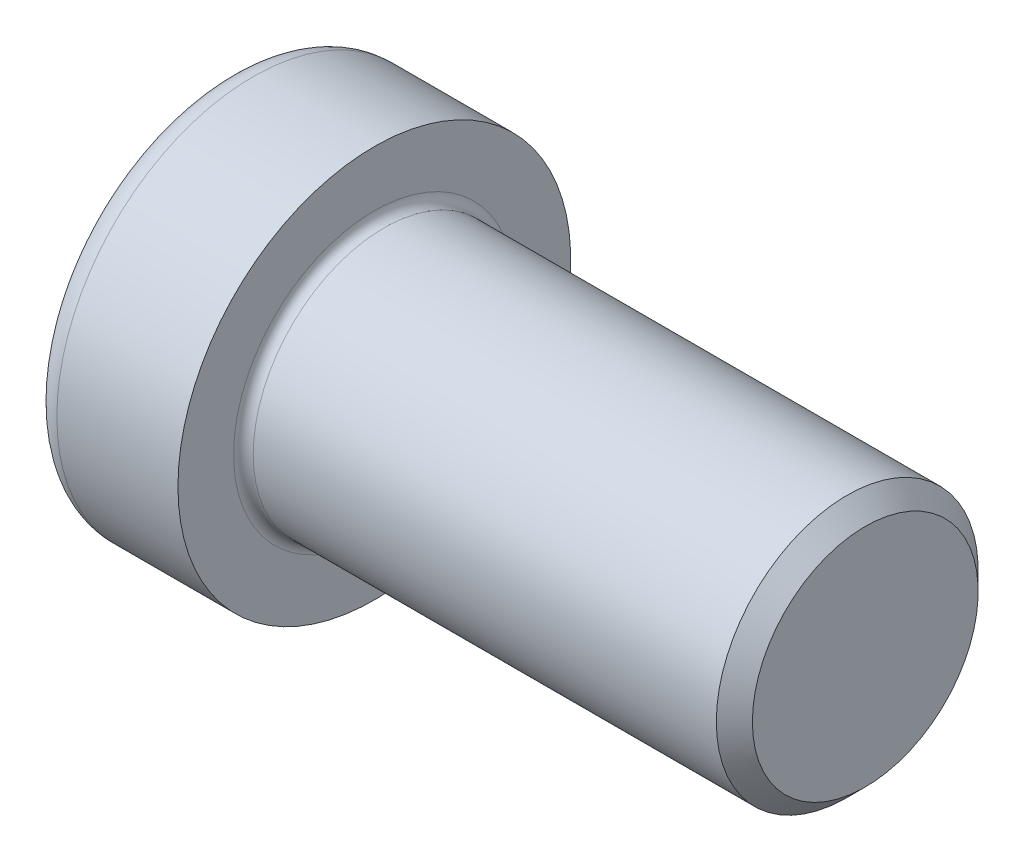
ISO-10303-21;
HEADER;
FILE_DESCRIPTION(('STEP AP214'),'2;1');
FILE_NAME('part.step','',(''),(''),'','','');
FILE_SCHEMA(('AUTOMOTIVE_DESIGN { 1 0 10303 214 1 1 1 1 }'));
ENDSEC;
DATA;
#1=APPLICATION_CONTEXT('core data for automotive mechanical design processes');
#2=APPLICATION_PROTOCOL_DEFINITION('international standard','automotive_design',2000,#1);
#3=PRODUCT_CONTEXT('',#1,'mechanical');
#4=PRODUCT('Part','Part','',(#3));
#5=PRODUCT_RELATED_PRODUCT_CATEGORY('part','',(#4));
#6=PRODUCT_DEFINITION_FORMATION('','',#4);
#7=PRODUCT_DEFINITION_CONTEXT('part definition',#1,'design');
#8=PRODUCT_DEFINITION('design','',#6,#7);
#9=PRODUCT_DEFINITION_SHAPE('','',#8);
#10=(LENGTH_UNIT() NAMED_UNIT(*) SI_UNIT(.MILLI.,.METRE.));
#11=(NAMED_UNIT(*) PLANE_ANGLE_UNIT() SI_UNIT($,.RADIAN.));
#12=(NAMED_UNIT(*) SI_UNIT($,.STERADIAN.) SOLID_ANGLE_UNIT());
#13=UNCERTAINTY_MEASURE_WITH_UNIT(LENGTH_MEASURE(1.E-05),#10,'distance_accuracy_value','');
#14=(GEOMETRIC_REPRESENTATION_CONTEXT(3) GLOBAL_UNCERTAINTY_ASSIGNED_CONTEXT((#13)) GLOBAL_UNIT_ASSIGNED_CONTEXT((#10,
#11,#12)) REPRESENTATION_CONTEXT('',''));
#15=CARTESIAN_POINT('',(0.,0.,0.));
#16=DIRECTION('',(0.,0.,1.));
#17=DIRECTION('',(1.,0.,0.));
#18=AXIS2_PLACEMENT_3D('',#15,#16,#17);
#19=CARTESIAN_POINT('',(0.,0.,0.));
#20=DIRECTION('',(-1.,0.,0.));
#21=DIRECTION('',(0.,0.,1.));
#22=AXIS2_PLACEMENT_3D('',#19,#20,#21);
#23=PLANE('',#22);
#24=DIRECTION('',(0.,-0.499999999999998,0.86602540378444));
#25=VECTOR('',#24,1.);
#26=CARTESIAN_POINT('',(0.,6.92820323027551,0.));
#27=LINE('',#26,#25);
#28=CARTESIAN_POINT('',(0.,6.92820323027551,0.));
#29=VERTEX_POINT('',#28);
#30=CARTESIAN_POINT('',(0.,3.46410161513777,5.99999999999999));
#31=VERTEX_POINT('',#30);
#32=EDGE_CURVE('E391',#29,#31,#27,.T.);
#33=ORIENTED_EDGE('',*,*,#32,.T.);
#34=DIRECTION('',(0.,1.,0.));
#35=VECTOR('',#34,1.);
#36=CARTESIAN_POINT('',(0.,-3.46410161513774,6.));
#37=LINE('',#36,#35);
#38=CARTESIAN_POINT('',(0.,-3.46410161513774,6.));
#39=VERTEX_POINT('',#38);
#40=EDGE_CURVE('E141',#39,#31,#37,.T.);
#41=ORIENTED_EDGE('',*,*,#40,.F.);
#42=DIRECTION('',(0.,-0.500000000000001,-0.866025403784438));
#43=VECTOR('',#42,1.);
#44=CARTESIAN_POINT('',(0.,-3.46410161513774,6.));
#45=LINE('',#44,#43);
#46=CARTESIAN_POINT('',(0.,-6.9282032302755,0.));
#47=VERTEX_POINT('',#46);
#48=EDGE_CURVE('E394',#39,#47,#45,.T.);
#49=ORIENTED_EDGE('',*,*,#48,.T.);
#50=DIRECTION('',(0.,0.499999999999998,-0.86602540378444));
#51=VECTOR('',#50,1.);
#52=CARTESIAN_POINT('',(0.,-6.9282032302755,0.));
#53=LINE('',#52,#51);
#54=CARTESIAN_POINT('',(0.,-3.46410161513776,-6.));
#55=VERTEX_POINT('',#54);
#56=EDGE_CURVE('E397',#47,#55,#53,.T.);
#57=ORIENTED_EDGE('',*,*,#56,.T.);
#58=DIRECTION('',(0.,-1.,0.));
#59=VECTOR('',#58,1.);
#60=CARTESIAN_POINT('',(0.,3.46410161513775,-6.00000000000001));
#61=LINE('',#60,#59);
#62=CARTESIAN_POINT('',(0.,3.46410161513775,-6.00000000000001));
#63=VERTEX_POINT('',#62);
#64=EDGE_CURVE('E400',#63,#55,#61,.T.);
#65=ORIENTED_EDGE('',*,*,#64,.F.);
#66=DIRECTION('',(0.,-0.500000000000001,-0.866025403784438));
#67=VECTOR('',#66,1.);
#68=CARTESIAN_POINT('',(0.,6.92820323027551,0.));
#69=LINE('',#68,#67);
#70=EDGE_CURVE('E136',#29,#63,#69,.T.);
#71=ORIENTED_EDGE('',*,*,#70,.F.);
#72=EDGE_LOOP('',(#33,#41,#49,#57,#65,#71));
#73=FACE_BOUND('',#72,.T.);
#74=CARTESIAN_POINT('',(0.,0.,0.));
#75=DIRECTION('',(-1.,0.,0.));
#76=DIRECTION('',(0.,0.,1.));
#77=AXIS2_PLACEMENT_3D('',#74,#75,#76);
#78=CIRCLE('',#77,10.4);
#79=CARTESIAN_POINT('',(0.,0.,10.4));
#80=VERTEX_POINT('',#79);
#81=EDGE_CURVE('E53',#80,#80,#78,.T.);
#82=ORIENTED_EDGE('',*,*,#81,.T.);
#83=EDGE_LOOP('',(#82));
#84=FACE_BOUND('',#83,.T.);
#85=ADVANCED_FACE('F45',(#73,#84),#23,.T.);
#86=CARTESIAN_POINT('',(39.,6.8985,0.));
#87=DIRECTION('',(1.,0.,0.));
#88=DIRECTION('',(0.,0.,-1.));
#89=AXIS2_PLACEMENT_3D('',#86,#87,#88);
#90=PLANE('',#89);
#91=CARTESIAN_POINT('',(39.,0.,0.));
#92=DIRECTION('',(-1.,0.,0.));
#93=DIRECTION('',(0.,0.,1.));
#94=AXIS2_PLACEMENT_3D('',#91,#92,#93);
#95=CIRCLE('',#94,6.8985);
#96=CARTESIAN_POINT('',(39.,0.,6.8985));
#97=VERTEX_POINT('',#96);
#98=EDGE_CURVE('E159',#97,#97,#95,.T.);
#99=ORIENTED_EDGE('',*,*,#98,.F.);
#100=EDGE_LOOP('',(#99));
#101=FACE_BOUND('',#100,.T.);
#102=ADVANCED_FACE('F184',(#101),#90,.T.);
#103=CARTESIAN_POINT('',(39.,0.,0.));
#104=DIRECTION('',(-1.,0.,0.));
#105=DIRECTION('',(0.,0.,1.));
#106=AXIS2_PLACEMENT_3D('',#103,#104,#105);
#107=CONICAL_SURFACE('',#106,6.8985,0.785398163397457);
#108=CARTESIAN_POINT('',(37.8985,0.,0.));
#109=DIRECTION('',(-1.,0.,0.));
#110=DIRECTION('',(0.,0.,1.));
#111=AXIS2_PLACEMENT_3D('',#108,#109,#110);
#112=CIRCLE('',#111,8.);
#113=CARTESIAN_POINT('',(37.8985,0.,8.));
#114=VERTEX_POINT('',#113);
#115=EDGE_CURVE('E156',#114,#114,#112,.T.);
#116=ORIENTED_EDGE('',*,*,#115,.F.);
#117=EDGE_LOOP('',(#116));
#118=FACE_BOUND('',#117,.T.);
#119=ORIENTED_EDGE('',*,*,#98,.T.);
#120=EDGE_LOOP('',(#119));
#121=FACE_BOUND('',#120,.T.);
#122=ADVANCED_FACE('F190',(#118,#121),#107,.T.);
#123=CARTESIAN_POINT('',(-31.75,0.,0.));
#124=DIRECTION('',(-1.,0.,0.));
#125=DIRECTION('',(0.,0.,1.));
#126=AXIS2_PLACEMENT_3D('',#123,#124,#125);
#127=CYLINDRICAL_SURFACE('',#126,8.);
#128=CARTESIAN_POINT('',(9.6,0.,0.));
#129=DIRECTION('',(1.,0.,0.));
#130=DIRECTION('',(0.,0.,-1.));
#131=AXIS2_PLACEMENT_3D('',#128,#129,#130);
#132=CIRCLE('',#131,8.);
#133=CARTESIAN_POINT('',(9.6,0.,-8.));
#134=VERTEX_POINT('',#133);
#135=EDGE_CURVE('E165',#134,#134,#132,.T.);
#136=ORIENTED_EDGE('',*,*,#135,.T.);
#137=EDGE_LOOP('',(#136));
#138=FACE_BOUND('',#137,.T.);
#139=ORIENTED_EDGE('',*,*,#115,.T.);
#140=EDGE_LOOP('',(#139));
#141=FACE_BOUND('',#140,.T.);
#142=ADVANCED_FACE('F201',(#138,#141),#127,.T.);
#143=CARTESIAN_POINT('',(9.,12.,0.));
#144=DIRECTION('',(1.,0.,0.));
#145=DIRECTION('',(0.,0.,-1.));
#146=AXIS2_PLACEMENT_3D('',#143,#144,#145);
#147=PLANE('',#146);
#148=CARTESIAN_POINT('',(9.,0.,0.));
#149=DIRECTION('',(1.,0.,0.));
#150=DIRECTION('',(0.,0.,-1.));
#151=AXIS2_PLACEMENT_3D('',#148,#149,#150);
#152=CIRCLE('',#151,8.6);
#153=CARTESIAN_POINT('',(9.,0.,-8.6));
#154=VERTEX_POINT('',#153);
#155=EDGE_CURVE('E162',#154,#154,#152,.F.);
#156=ORIENTED_EDGE('',*,*,#155,.T.);
#157=EDGE_LOOP('',(#156));
#158=FACE_BOUND('',#157,.T.);
#159=CARTESIAN_POINT('',(9.,0.,0.));
#160=DIRECTION('',(-1.,0.,0.));
#161=DIRECTION('',(0.,0.,1.));
#162=AXIS2_PLACEMENT_3D('',#159,#160,#161);
#163=CIRCLE('',#162,12.);
#164=CARTESIAN_POINT('',(9.,0.,12.));
#165=VERTEX_POINT('',#164);
#166=EDGE_CURVE('E152',#165,#165,#163,.T.);
#167=ORIENTED_EDGE('',*,*,#166,.F.);
#168=EDGE_LOOP('',(#167));
#169=FACE_BOUND('',#168,.T.);
#170=ADVANCED_FACE('F197',(#158,#169),#147,.T.);
#171=CARTESIAN_POINT('',(-31.75,0.,0.));
#172=DIRECTION('',(-1.,0.,0.));
#173=DIRECTION('',(0.,0.,1.));
#174=AXIS2_PLACEMENT_3D('',#171,#172,#173);
#175=CYLINDRICAL_SURFACE('',#174,12.);
#176=CARTESIAN_POINT('',(1.6,0.,0.));
#177=DIRECTION('',(-1.,0.,0.));
#178=DIRECTION('',(0.,0.,1.));
#179=AXIS2_PLACEMENT_3D('',#176,#177,#178);
#180=CIRCLE('',#179,12.);
#181=CARTESIAN_POINT('',(1.6,0.,12.));
#182=VERTEX_POINT('',#181);
#183=EDGE_CURVE('E11',#182,#182,#180,.F.);
#184=ORIENTED_EDGE('',*,*,#183,.T.);
#185=EDGE_LOOP('',(#184));
#186=FACE_BOUND('',#185,.T.);
#187=ORIENTED_EDGE('',*,*,#166,.T.);
#188=EDGE_LOOP('',(#187));
#189=FACE_BOUND('',#188,.T.);
#190=ADVANCED_FACE('F181',(#186,#189),#175,.T.);
#191=CARTESIAN_POINT('',(9.6,0.,0.));
#192=DIRECTION('',(1.,0.,0.));
#193=DIRECTION('',(0.,0.,-1.));
#194=AXIS2_PLACEMENT_3D('',#191,#192,#193);
#195=TOROIDAL_SURFACE('',#194,8.6,0.6);
#196=ORIENTED_EDGE('',*,*,#135,.F.);
#197=EDGE_LOOP('',(#196));
#198=FACE_BOUND('',#197,.T.);
#199=ORIENTED_EDGE('',*,*,#155,.F.);
#200=EDGE_LOOP('',(#199));
#201=FACE_BOUND('',#200,.T.);
#202=ADVANCED_FACE('F172',(#198,#201),#195,.F.);
#203=CARTESIAN_POINT('',(1.6,0.,0.));
#204=DIRECTION('',(-1.,0.,0.));
#205=DIRECTION('',(0.,0.,1.));
#206=AXIS2_PLACEMENT_3D('',#203,#204,#205);
#207=TOROIDAL_SURFACE('',#206,10.4,1.6);
#208=ORIENTED_EDGE('',*,*,#183,.F.);
#209=EDGE_LOOP('',(#208));
#210=FACE_BOUND('',#209,.T.);
#211=ORIENTED_EDGE('',*,*,#81,.F.);
#212=EDGE_LOOP('',(#211));
#213=FACE_BOUND('',#212,.T.);
#214=ADVANCED_FACE('F47',(#210,#213),#207,.T.);
#215=CARTESIAN_POINT('',(5.5,6.92820323027551,0.));
#216=DIRECTION('',(0.,-0.86602540378444,-0.499999999999998));
#217=DIRECTION('',(0.,0.499999999999998,-0.86602540378444));
#218=AXIS2_PLACEMENT_3D('',#215,#216,#217);
#219=PLANE('',#218);
#220=ORIENTED_EDGE('',*,*,#32,.F.);
#221=DIRECTION('',(-1.,0.,0.));
#222=VECTOR('',#221,1.);
#223=CARTESIAN_POINT('',(5.5,6.92820323027551,0.));
#224=LINE('',#223,#222);
#225=CARTESIAN_POINT('',(5.5,6.92820323027551,0.));
#226=VERTEX_POINT('',#225);
#227=EDGE_CURVE('E381',#226,#29,#224,.T.);
#228=ORIENTED_EDGE('',*,*,#227,.F.);
#229=DIRECTION('',(0.,-0.499999999999998,0.86602540378444));
#230=VECTOR('',#229,1.);
#231=CARTESIAN_POINT('',(5.5,6.92820323027551,0.));
#232=LINE('',#231,#230);
#233=CARTESIAN_POINT('',(5.5,5.19615242270664,2.99999999999999));
#234=VERTEX_POINT('',#233);
#235=EDGE_CURVE('E128',#226,#234,#232,.T.);
#236=ORIENTED_EDGE('',*,*,#235,.T.);
#237=CARTESIAN_POINT('',(5.5,3.46410161513777,5.99999999999999));
#238=VERTEX_POINT('',#237);
#239=EDGE_CURVE('E119',#234,#238,#232,.T.);
#240=ORIENTED_EDGE('',*,*,#239,.T.);
#241=DIRECTION('',(-1.,0.,0.));
#242=VECTOR('',#241,1.);
#243=CARTESIAN_POINT('',(5.5,3.46410161513777,5.99999999999999));
#244=LINE('',#243,#242);
#245=EDGE_CURVE('E133',#238,#31,#244,.T.);
#246=ORIENTED_EDGE('',*,*,#245,.T.);
#247=EDGE_LOOP('',(#220,#228,#236,#240,#246));
#248=FACE_BOUND('',#247,.T.);
#249=ADVANCED_FACE('F132',(#248),#219,.T.);
#250=CARTESIAN_POINT('',(5.5,-3.46410161513774,6.));
#251=DIRECTION('',(0.,0.,1.));
#252=DIRECTION('',(0.,-1.,0.));
#253=AXIS2_PLACEMENT_3D('',#250,#251,#252);
#254=PLANE('',#253);
#255=ORIENTED_EDGE('',*,*,#40,.T.);
#256=ORIENTED_EDGE('',*,*,#245,.F.);
#257=DIRECTION('',(0.,1.,0.));
#258=VECTOR('',#257,1.);
#259=CARTESIAN_POINT('',(5.5,-3.46410161513774,6.));
#260=LINE('',#259,#258);
#261=CARTESIAN_POINT('',(5.5,0.,6.));
#262=VERTEX_POINT('',#261);
#263=EDGE_CURVE('E116',#262,#238,#260,.T.);
#264=ORIENTED_EDGE('',*,*,#263,.F.);
#265=CARTESIAN_POINT('',(5.5,-3.46410161513774,6.));
#266=VERTEX_POINT('',#265);
#267=EDGE_CURVE('E127',#266,#262,#260,.T.);
#268=ORIENTED_EDGE('',*,*,#267,.F.);
#269=DIRECTION('',(-1.,0.,0.));
#270=VECTOR('',#269,1.);
#271=CARTESIAN_POINT('',(5.5,-3.46410161513774,6.));
#272=LINE('',#271,#270);
#273=EDGE_CURVE('E143',#266,#39,#272,.T.);
#274=ORIENTED_EDGE('',*,*,#273,.T.);
#275=EDGE_LOOP('',(#255,#256,#264,#268,#274));
#276=FACE_BOUND('',#275,.T.);
#277=ADVANCED_FACE('F138',(#276),#254,.F.);
#278=CARTESIAN_POINT('',(5.5,-3.46410161513774,6.));
#279=DIRECTION('',(0.,0.866025403784438,-0.500000000000001));
#280=DIRECTION('',(0.,0.500000000000001,0.866025403784438));
#281=AXIS2_PLACEMENT_3D('',#278,#279,#280);
#282=PLANE('',#281);
#283=ORIENTED_EDGE('',*,*,#48,.F.);
#284=ORIENTED_EDGE('',*,*,#273,.F.);
#285=DIRECTION('',(0.,-0.500000000000001,-0.866025403784438));
#286=VECTOR('',#285,1.);
#287=CARTESIAN_POINT('',(5.5,-3.46410161513774,6.));
#288=LINE('',#287,#286);
#289=CARTESIAN_POINT('',(5.5,-5.19615242270662,3.));
#290=VERTEX_POINT('',#289);
#291=EDGE_CURVE('E420',#266,#290,#288,.T.);
#292=ORIENTED_EDGE('',*,*,#291,.T.);
#293=CARTESIAN_POINT('',(5.5,-6.9282032302755,0.));
#294=VERTEX_POINT('',#293);
#295=EDGE_CURVE('E409',#290,#294,#288,.T.);
#296=ORIENTED_EDGE('',*,*,#295,.T.);
#297=DIRECTION('',(-1.,0.,0.));
#298=VECTOR('',#297,1.);
#299=CARTESIAN_POINT('',(5.5,-6.9282032302755,0.));
#300=LINE('',#299,#298);
#301=EDGE_CURVE('E148',#294,#47,#300,.T.);
#302=ORIENTED_EDGE('',*,*,#301,.T.);
#303=EDGE_LOOP('',(#283,#284,#292,#296,#302));
#304=FACE_BOUND('',#303,.T.);
#305=ADVANCED_FACE('F270',(#304),#282,.T.);
#306=CARTESIAN_POINT('',(5.5,-6.9282032302755,0.));
#307=DIRECTION('',(0.,0.86602540378444,0.499999999999998));
#308=DIRECTION('',(0.,-0.499999999999998,0.86602540378444));
#309=AXIS2_PLACEMENT_3D('',#306,#307,#308);
#310=PLANE('',#309);
#311=ORIENTED_EDGE('',*,*,#56,.F.);
#312=ORIENTED_EDGE('',*,*,#301,.F.);
#313=DIRECTION('',(0.,0.499999999999998,-0.86602540378444));
#314=VECTOR('',#313,1.);
#315=CARTESIAN_POINT('',(5.5,-6.9282032302755,0.));
#316=LINE('',#315,#314);
#317=CARTESIAN_POINT('',(5.5,-5.19615242270664,-2.99999999999998));
#318=VERTEX_POINT('',#317);
#319=EDGE_CURVE('E387',#294,#318,#316,.T.);
#320=ORIENTED_EDGE('',*,*,#319,.T.);
#321=CARTESIAN_POINT('',(5.5,-3.46410161513776,-6.));
#322=VERTEX_POINT('',#321);
#323=EDGE_CURVE('E419',#318,#322,#316,.T.);
#324=ORIENTED_EDGE('',*,*,#323,.T.);
#325=DIRECTION('',(-1.,0.,0.));
#326=VECTOR('',#325,1.);
#327=CARTESIAN_POINT('',(5.5,-3.46410161513776,-6.));
#328=LINE('',#327,#326);
#329=EDGE_CURVE('E380',#322,#55,#328,.T.);
#330=ORIENTED_EDGE('',*,*,#329,.T.);
#331=EDGE_LOOP('',(#311,#312,#320,#324,#330));
#332=FACE_BOUND('',#331,.T.);
#333=ADVANCED_FACE('F278',(#332),#310,.T.);
#334=CARTESIAN_POINT('',(5.5,3.46410161513775,-6.00000000000001));
#335=DIRECTION('',(0.,0.,-1.));
#336=DIRECTION('',(0.,1.,0.));
#337=AXIS2_PLACEMENT_3D('',#334,#335,#336);
#338=PLANE('',#337);
#339=ORIENTED_EDGE('',*,*,#64,.T.);
#340=ORIENTED_EDGE('',*,*,#329,.F.);
#341=DIRECTION('',(0.,-1.,0.));
#342=VECTOR('',#341,1.);
#343=CARTESIAN_POINT('',(5.5,3.46410161513775,-6.00000000000001));
#344=LINE('',#343,#342);
#345=CARTESIAN_POINT('',(5.5,0.,-6.));
#346=VERTEX_POINT('',#345);
#347=EDGE_CURVE('E384',#346,#322,#344,.T.);
#348=ORIENTED_EDGE('',*,*,#347,.F.);
#349=CARTESIAN_POINT('',(5.5,3.46410161513775,-6.00000000000001));
#350=VERTEX_POINT('',#349);
#351=EDGE_CURVE('E60',#350,#346,#344,.T.);
#352=ORIENTED_EDGE('',*,*,#351,.F.);
#353=DIRECTION('',(-1.,0.,0.));
#354=VECTOR('',#353,1.);
#355=CARTESIAN_POINT('',(5.5,3.46410161513775,-6.00000000000001));
#356=LINE('',#355,#354);
#357=EDGE_CURVE('E377',#350,#63,#356,.T.);
#358=ORIENTED_EDGE('',*,*,#357,.T.);
#359=EDGE_LOOP('',(#339,#340,#348,#352,#358));
#360=FACE_BOUND('',#359,.T.);
#361=ADVANCED_FACE('F287',(#360),#338,.F.);
#362=CARTESIAN_POINT('',(5.5,6.92820323027551,0.));
#363=DIRECTION('',(0.,0.866025403784438,-0.500000000000001));
#364=DIRECTION('',(0.,0.500000000000001,0.866025403784438));
#365=AXIS2_PLACEMENT_3D('',#362,#363,#364);
#366=PLANE('',#365);
#367=ORIENTED_EDGE('',*,*,#70,.T.);
#368=ORIENTED_EDGE('',*,*,#357,.F.);
#369=DIRECTION('',(0.,-0.500000000000001,-0.866025403784438));
#370=VECTOR('',#369,1.);
#371=CARTESIAN_POINT('',(5.5,6.92820323027551,0.));
#372=LINE('',#371,#370);
#373=CARTESIAN_POINT('',(5.5,5.19615242270663,-3.00000000000001));
#374=VERTEX_POINT('',#373);
#375=EDGE_CURVE('E367',#374,#350,#372,.T.);
#376=ORIENTED_EDGE('',*,*,#375,.F.);
#377=EDGE_CURVE('E373',#226,#374,#372,.T.);
#378=ORIENTED_EDGE('',*,*,#377,.F.);
#379=ORIENTED_EDGE('',*,*,#227,.T.);
#380=EDGE_LOOP('',(#367,#368,#376,#378,#379));
#381=FACE_BOUND('',#380,.T.);
#382=ADVANCED_FACE('F296',(#381),#366,.F.);
#383=CARTESIAN_POINT('',(5.5,10.3923048454132,-6.00000000000002));
#384=DIRECTION('',(1.,0.,0.));
#385=DIRECTION('',(0.,0.,-1.));
#386=AXIS2_PLACEMENT_3D('',#383,#384,#385);
#387=PLANE('',#386);
#388=ORIENTED_EDGE('',*,*,#347,.T.);
#389=ORIENTED_EDGE('',*,*,#323,.F.);
#390=CARTESIAN_POINT('',(5.5,0.,0.));
#391=DIRECTION('',(-1.,0.,0.));
#392=DIRECTION('',(0.,0.,1.));
#393=AXIS2_PLACEMENT_3D('',#390,#391,#392);
#394=CIRCLE('',#393,6.);
#395=EDGE_CURVE('E415',#346,#318,#394,.T.);
#396=ORIENTED_EDGE('',*,*,#395,.F.);
#397=EDGE_LOOP('',(#388,#389,#396));
#398=FACE_BOUND('',#397,.T.);
#399=ADVANCED_FACE('F305',(#398),#387,.F.);
#400=ORIENTED_EDGE('',*,*,#319,.F.);
#401=ORIENTED_EDGE('',*,*,#295,.F.);
#402=EDGE_CURVE('E146',#318,#290,#394,.T.);
#403=ORIENTED_EDGE('',*,*,#402,.F.);
#404=EDGE_LOOP('',(#400,#401,#403));
#405=FACE_BOUND('',#404,.T.);
#406=ADVANCED_FACE('F314',(#405),#387,.F.);
#407=ORIENTED_EDGE('',*,*,#291,.F.);
#408=ORIENTED_EDGE('',*,*,#267,.T.);
#409=EDGE_CURVE('E142',#290,#262,#394,.T.);
#410=ORIENTED_EDGE('',*,*,#409,.F.);
#411=EDGE_LOOP('',(#407,#408,#410));
#412=FACE_BOUND('',#411,.T.);
#413=ADVANCED_FACE('F323',(#412),#387,.F.);
#414=ORIENTED_EDGE('',*,*,#263,.T.);
#415=ORIENTED_EDGE('',*,*,#239,.F.);
#416=EDGE_CURVE('E122',#262,#234,#394,.T.);
#417=ORIENTED_EDGE('',*,*,#416,.F.);
#418=EDGE_LOOP('',(#414,#415,#417));
#419=FACE_BOUND('',#418,.T.);
#420=ADVANCED_FACE('F118',(#419),#387,.F.);
#421=ORIENTED_EDGE('',*,*,#235,.F.);
#422=ORIENTED_EDGE('',*,*,#377,.T.);
#423=EDGE_CURVE('E153',#234,#374,#394,.T.);
#424=ORIENTED_EDGE('',*,*,#423,.F.);
#425=EDGE_LOOP('',(#421,#422,#424));
#426=FACE_BOUND('',#425,.T.);
#427=ADVANCED_FACE('F338',(#426),#387,.F.);
#428=ORIENTED_EDGE('',*,*,#375,.T.);
#429=ORIENTED_EDGE('',*,*,#351,.T.);
#430=EDGE_CURVE('E370',#374,#346,#394,.T.);
#431=ORIENTED_EDGE('',*,*,#430,.F.);
#432=EDGE_LOOP('',(#428,#429,#431));
#433=FACE_BOUND('',#432,.T.);
#434=ADVANCED_FACE('F253',(#433),#387,.F.);
#435=CARTESIAN_POINT('',(5.5,0.,0.));
#436=DIRECTION('',(-1.,0.,0.));
#437=DIRECTION('',(0.,0.,1.));
#438=AXIS2_PLACEMENT_3D('',#435,#436,#437);
#439=CONICAL_SURFACE('',#438,6.,1.04719755119659);
#440=CARTESIAN_POINT('',(8.96410161513778,0.,0.));
#441=VERTEX_POINT('',#440);
#442=VERTEX_LOOP('',#441);
#443=FACE_BOUND('',#442,.T.);
#444=ORIENTED_EDGE('',*,*,#416,.T.);
#445=ORIENTED_EDGE('',*,*,#423,.T.);
#446=ORIENTED_EDGE('',*,*,#430,.T.);
#447=ORIENTED_EDGE('',*,*,#395,.T.);
#448=ORIENTED_EDGE('',*,*,#402,.T.);
#449=ORIENTED_EDGE('',*,*,#409,.T.);
#450=EDGE_LOOP('',(#444,#445,#446,#447,#448,#449));
#451=FACE_BOUND('',#450,.T.);
#452=ADVANCED_FACE('F195',(#443,#451),#439,.F.);
#453=CLOSED_SHELL('',(#85,#102,#122,#142,#170,#190,#202,#214,#249,#277,#305,#333,#361,#382,#399,
#406,#413,#420,#427,#434,#452));
#454=MANIFOLD_SOLID_BREP('B2',#453);
#455=ADVANCED_BREP_SHAPE_REPRESENTATION('',(#18,#454),#14);
#456=SHAPE_DEFINITION_REPRESENTATION(#9,#455);
ENDSEC;
END-ISO-10303-21;
